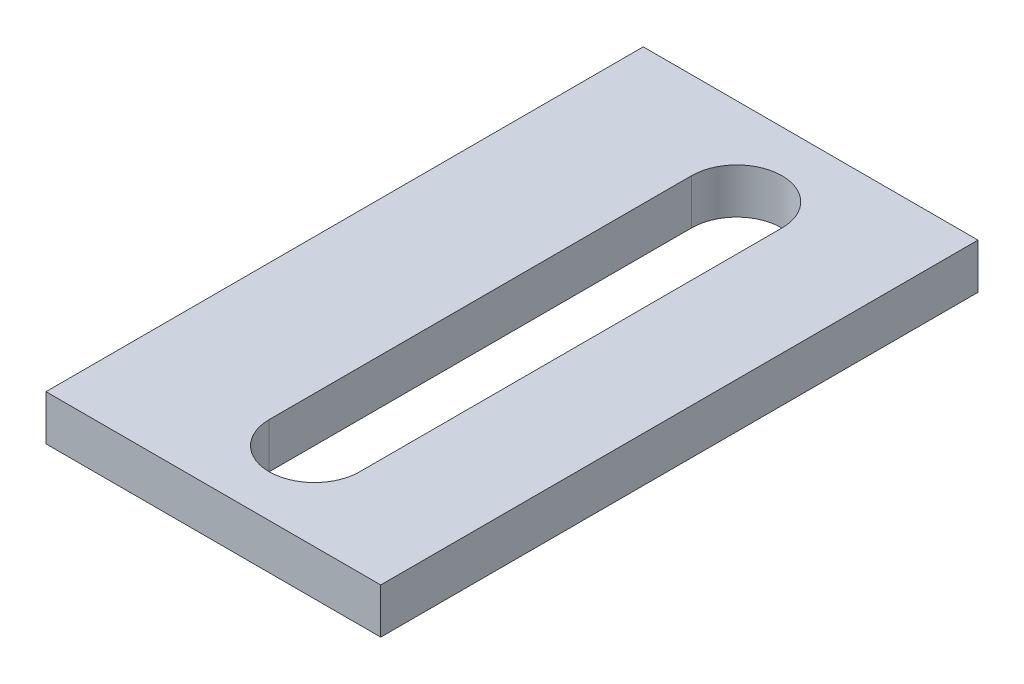
ISO-10303-21;
HEADER;
FILE_DESCRIPTION(('STEP AP214'),'2;1');
FILE_NAME('part.step','',(''),(''),'','','');
FILE_SCHEMA(('AUTOMOTIVE_DESIGN { 1 0 10303 214 1 1 1 1 }'));
ENDSEC;
DATA;
#1=APPLICATION_CONTEXT('core data for automotive mechanical design processes');
#2=APPLICATION_PROTOCOL_DEFINITION('international standard','automotive_design',2000,#1);
#3=PRODUCT_CONTEXT('',#1,'mechanical');
#4=PRODUCT('Part','Part','',(#3));
#5=PRODUCT_RELATED_PRODUCT_CATEGORY('part','',(#4));
#6=PRODUCT_DEFINITION_FORMATION('','',#4);
#7=PRODUCT_DEFINITION_CONTEXT('part definition',#1,'design');
#8=PRODUCT_DEFINITION('design','',#6,#7);
#9=PRODUCT_DEFINITION_SHAPE('','',#8);
#10=(LENGTH_UNIT() NAMED_UNIT(*) SI_UNIT(.MILLI.,.METRE.));
#11=(NAMED_UNIT(*) PLANE_ANGLE_UNIT() SI_UNIT($,.RADIAN.));
#12=(NAMED_UNIT(*) SI_UNIT($,.STERADIAN.) SOLID_ANGLE_UNIT());
#13=UNCERTAINTY_MEASURE_WITH_UNIT(LENGTH_MEASURE(1.E-05),#10,'distance_accuracy_value','');
#14=(GEOMETRIC_REPRESENTATION_CONTEXT(3) GLOBAL_UNCERTAINTY_ASSIGNED_CONTEXT((#13)) GLOBAL_UNIT_ASSIGNED_CONTEXT((#10,
#11,#12)) REPRESENTATION_CONTEXT('',''));
#15=CARTESIAN_POINT('',(0.,0.,0.));
#16=DIRECTION('',(0.,0.,1.));
#17=DIRECTION('',(1.,0.,0.));
#18=AXIS2_PLACEMENT_3D('',#15,#16,#17);
#19=CARTESIAN_POINT('',(-12.,8.4,6.9));
#20=DIRECTION('',(1.,0.,0.));
#21=DIRECTION('',(0.,0.,-1.));
#22=AXIS2_PLACEMENT_3D('',#19,#20,#21);
#23=PLANE('',#22);
#24=DIRECTION('',(0.,1.,0.));
#25=VECTOR('',#24,1.);
#26=CARTESIAN_POINT('',(-12.,8.4,-9.9));
#27=LINE('',#26,#25);
#28=CARTESIAN_POINT('',(-12.,6.9,-9.9));
#29=VERTEX_POINT('',#28);
#30=CARTESIAN_POINT('',(-12.,8.4,-9.9));
#31=VERTEX_POINT('',#30);
#32=EDGE_CURVE('E121',#29,#31,#27,.T.);
#33=ORIENTED_EDGE('',*,*,#32,.F.);
#34=DIRECTION('',(0.,0.,-1.));
#35=VECTOR('',#34,1.);
#36=CARTESIAN_POINT('',(-12.,6.9,-9.9));
#37=LINE('',#36,#35);
#38=CARTESIAN_POINT('',(-12.,6.9,9.9));
#39=VERTEX_POINT('',#38);
#40=EDGE_CURVE('E107',#39,#29,#37,.T.);
#41=ORIENTED_EDGE('',*,*,#40,.F.);
#42=DIRECTION('',(0.,-1.,0.));
#43=VECTOR('',#42,1.);
#44=CARTESIAN_POINT('',(-12.,8.4,9.9));
#45=LINE('',#44,#43);
#46=CARTESIAN_POINT('',(-12.,8.4,9.9));
#47=VERTEX_POINT('',#46);
#48=EDGE_CURVE('E137',#47,#39,#45,.T.);
#49=ORIENTED_EDGE('',*,*,#48,.F.);
#50=DIRECTION('',(0.,0.,1.));
#51=VECTOR('',#50,1.);
#52=CARTESIAN_POINT('',(-12.,8.4,6.9));
#53=LINE('',#52,#51);
#54=EDGE_CURVE('E128',#31,#47,#53,.T.);
#55=ORIENTED_EDGE('',*,*,#54,.F.);
#56=EDGE_LOOP('',(#33,#41,#49,#55));
#57=FACE_BOUND('',#56,.T.);
#58=ADVANCED_FACE('F44',(#57),#23,.F.);
#59=CARTESIAN_POINT('',(0.,8.4,0.));
#60=DIRECTION('',(0.,1.,0.));
#61=DIRECTION('',(0.,0.,1.));
#62=AXIS2_PLACEMENT_3D('',#59,#60,#61);
#63=PLANE('',#62);
#64=DIRECTION('',(0.,0.,1.));
#65=VECTOR('',#64,1.);
#66=CARTESIAN_POINT('',(-0.902865486843041,8.4,-26.1));
#67=LINE('',#66,#65);
#68=CARTESIAN_POINT('',(-0.902865486843041,8.4,-9.9));
#69=VERTEX_POINT('',#68);
#70=CARTESIAN_POINT('',(-0.902865486843041,8.4,9.9));
#71=VERTEX_POINT('',#70);
#72=EDGE_CURVE('E181',#69,#71,#67,.T.);
#73=ORIENTED_EDGE('',*,*,#72,.F.);
#74=DIRECTION('',(1.,0.,0.));
#75=VECTOR('',#74,1.);
#76=CARTESIAN_POINT('',(-12.,8.4,-9.9));
#77=LINE('',#76,#75);
#78=EDGE_CURVE('E131',#31,#69,#77,.T.);
#79=ORIENTED_EDGE('',*,*,#78,.F.);
#80=ORIENTED_EDGE('',*,*,#54,.T.);
#81=DIRECTION('',(-1.,0.,0.));
#82=VECTOR('',#81,1.);
#83=CARTESIAN_POINT('',(-12.,8.4,9.9));
#84=LINE('',#83,#82);
#85=EDGE_CURVE('E132',#71,#47,#84,.T.);
#86=ORIENTED_EDGE('',*,*,#85,.F.);
#87=EDGE_LOOP('',(#73,#79,#80,#86));
#88=FACE_BOUND('',#87,.T.);
#89=CARTESIAN_POINT('',(-6.,8.4,-7.));
#90=DIRECTION('',(0.,1.,0.));
#91=DIRECTION('',(0.,0.,1.));
#92=AXIS2_PLACEMENT_3D('',#89,#90,#91);
#93=CIRCLE('',#92,1.5);
#94=CARTESIAN_POINT('',(-4.5,8.4,-7.));
#95=VERTEX_POINT('',#94);
#96=CARTESIAN_POINT('',(-7.5,8.4,-7.));
#97=VERTEX_POINT('',#96);
#98=EDGE_CURVE('E11',#95,#97,#93,.T.);
#99=ORIENTED_EDGE('',*,*,#98,.F.);
#100=DIRECTION('',(0.,0.,-1.));
#101=VECTOR('',#100,1.);
#102=CARTESIAN_POINT('',(-4.5,8.4,0.));
#103=LINE('',#102,#101);
#104=CARTESIAN_POINT('',(-4.5,8.4,7.));
#105=VERTEX_POINT('',#104);
#106=EDGE_CURVE('E146',#105,#95,#103,.T.);
#107=ORIENTED_EDGE('',*,*,#106,.F.);
#108=CARTESIAN_POINT('',(-6.,8.4,7.));
#109=DIRECTION('',(0.,1.,0.));
#110=DIRECTION('',(0.,0.,1.));
#111=AXIS2_PLACEMENT_3D('',#108,#109,#110);
#112=CIRCLE('',#111,1.5);
#113=CARTESIAN_POINT('',(-7.5,8.4,7.));
#114=VERTEX_POINT('',#113);
#115=EDGE_CURVE('E52',#114,#105,#112,.T.);
#116=ORIENTED_EDGE('',*,*,#115,.F.);
#117=DIRECTION('',(0.,0.,1.));
#118=VECTOR('',#117,1.);
#119=CARTESIAN_POINT('',(-7.5,8.4,0.));
#120=LINE('',#119,#118);
#121=EDGE_CURVE('E143',#97,#114,#120,.T.);
#122=ORIENTED_EDGE('',*,*,#121,.F.);
#123=EDGE_LOOP('',(#99,#107,#116,#122));
#124=FACE_BOUND('',#123,.T.);
#125=ADVANCED_FACE('F163',(#88,#124),#63,.T.);
#126=CARTESIAN_POINT('',(0.,0.,-9.9));
#127=DIRECTION('',(0.,0.,1.));
#128=DIRECTION('',(1.,0.,0.));
#129=AXIS2_PLACEMENT_3D('',#126,#127,#128);
#130=PLANE('',#129);
#131=DIRECTION('',(0.,-1.,0.));
#132=VECTOR('',#131,1.);
#133=CARTESIAN_POINT('',(-0.902865486843041,0.,-9.9));
#134=LINE('',#133,#132);
#135=CARTESIAN_POINT('',(-0.902865486843041,6.9,-9.9));
#136=VERTEX_POINT('',#135);
#137=EDGE_CURVE('E123',#69,#136,#134,.T.);
#138=ORIENTED_EDGE('',*,*,#137,.T.);
#139=DIRECTION('',(1.,0.,0.));
#140=VECTOR('',#139,1.);
#141=CARTESIAN_POINT('',(-12.,6.9,-9.9));
#142=LINE('',#141,#140);
#143=EDGE_CURVE('E67',#29,#136,#142,.T.);
#144=ORIENTED_EDGE('',*,*,#143,.F.);
#145=ORIENTED_EDGE('',*,*,#32,.T.);
#146=ORIENTED_EDGE('',*,*,#78,.T.);
#147=EDGE_LOOP('',(#138,#144,#145,#146));
#148=FACE_BOUND('',#147,.T.);
#149=ADVANCED_FACE('F119',(#148),#130,.F.);
#150=CARTESIAN_POINT('',(0.,0.,9.9));
#151=DIRECTION('',(0.,0.,1.));
#152=DIRECTION('',(1.,0.,0.));
#153=AXIS2_PLACEMENT_3D('',#150,#151,#152);
#154=PLANE('',#153);
#155=DIRECTION('',(-1.,0.,0.));
#156=VECTOR('',#155,1.);
#157=CARTESIAN_POINT('',(0.,6.9,9.9));
#158=LINE('',#157,#156);
#159=CARTESIAN_POINT('',(-0.902865486843041,6.9,9.9));
#160=VERTEX_POINT('',#159);
#161=EDGE_CURVE('E110',#160,#39,#158,.T.);
#162=ORIENTED_EDGE('',*,*,#161,.F.);
#163=DIRECTION('',(0.,-1.,0.));
#164=VECTOR('',#163,1.);
#165=CARTESIAN_POINT('',(-0.902865486843041,8.4,9.9));
#166=LINE('',#165,#164);
#167=EDGE_CURVE('E184',#71,#160,#166,.T.);
#168=ORIENTED_EDGE('',*,*,#167,.F.);
#169=ORIENTED_EDGE('',*,*,#85,.T.);
#170=ORIENTED_EDGE('',*,*,#48,.T.);
#171=EDGE_LOOP('',(#162,#168,#169,#170));
#172=FACE_BOUND('',#171,.T.);
#173=ADVANCED_FACE('F206',(#172),#154,.T.);
#174=CARTESIAN_POINT('',(-6.,-30.6,-7.));
#175=DIRECTION('',(0.,1.,0.));
#176=DIRECTION('',(0.,0.,1.));
#177=AXIS2_PLACEMENT_3D('',#174,#175,#176);
#178=CYLINDRICAL_SURFACE('',#177,1.5);
#179=DIRECTION('',(0.,1.,0.));
#180=VECTOR('',#179,1.);
#181=CARTESIAN_POINT('',(-7.5,-30.6,-7.));
#182=LINE('',#181,#180);
#183=CARTESIAN_POINT('',(-7.5,6.9,-7.));
#184=VERTEX_POINT('',#183);
#185=EDGE_CURVE('E172',#184,#97,#182,.T.);
#186=ORIENTED_EDGE('',*,*,#185,.F.);
#187=CARTESIAN_POINT('',(-6.,6.9,-7.));
#188=DIRECTION('',(0.,1.,0.));
#189=DIRECTION('',(0.,0.,1.));
#190=AXIS2_PLACEMENT_3D('',#187,#188,#189);
#191=CIRCLE('',#190,1.5);
#192=CARTESIAN_POINT('',(-4.5,6.9,-7.));
#193=VERTEX_POINT('',#192);
#194=EDGE_CURVE('E59',#184,#193,#191,.F.);
#195=ORIENTED_EDGE('',*,*,#194,.T.);
#196=DIRECTION('',(0.,1.,0.));
#197=VECTOR('',#196,1.);
#198=CARTESIAN_POINT('',(-4.5,-30.6,-7.));
#199=LINE('',#198,#197);
#200=EDGE_CURVE('E147',#193,#95,#199,.T.);
#201=ORIENTED_EDGE('',*,*,#200,.T.);
#202=ORIENTED_EDGE('',*,*,#98,.T.);
#203=EDGE_LOOP('',(#186,#195,#201,#202));
#204=FACE_BOUND('',#203,.T.);
#205=ADVANCED_FACE('F220',(#204),#178,.F.);
#206=CARTESIAN_POINT('',(-6.,-30.6,7.));
#207=DIRECTION('',(0.,1.,0.));
#208=DIRECTION('',(0.,0.,1.));
#209=AXIS2_PLACEMENT_3D('',#206,#207,#208);
#210=CYLINDRICAL_SURFACE('',#209,1.5);
#211=DIRECTION('',(0.,1.,0.));
#212=VECTOR('',#211,1.);
#213=CARTESIAN_POINT('',(-4.5,-30.6,7.));
#214=LINE('',#213,#212);
#215=CARTESIAN_POINT('',(-4.5,6.9,7.));
#216=VERTEX_POINT('',#215);
#217=EDGE_CURVE('E156',#216,#105,#214,.T.);
#218=ORIENTED_EDGE('',*,*,#217,.F.);
#219=CARTESIAN_POINT('',(-6.,6.9,7.));
#220=DIRECTION('',(0.,1.,0.));
#221=DIRECTION('',(0.,0.,1.));
#222=AXIS2_PLACEMENT_3D('',#219,#220,#221);
#223=CIRCLE('',#222,1.5);
#224=CARTESIAN_POINT('',(-7.5,6.9,7.));
#225=VERTEX_POINT('',#224);
#226=EDGE_CURVE('E196',#216,#225,#223,.F.);
#227=ORIENTED_EDGE('',*,*,#226,.T.);
#228=DIRECTION('',(0.,1.,0.));
#229=VECTOR('',#228,1.);
#230=CARTESIAN_POINT('',(-7.5,-30.6,7.));
#231=LINE('',#230,#229);
#232=EDGE_CURVE('E158',#225,#114,#231,.T.);
#233=ORIENTED_EDGE('',*,*,#232,.T.);
#234=ORIENTED_EDGE('',*,*,#115,.T.);
#235=EDGE_LOOP('',(#218,#227,#233,#234));
#236=FACE_BOUND('',#235,.T.);
#237=ADVANCED_FACE('F154',(#236),#210,.F.);
#238=CARTESIAN_POINT('',(-4.5,-30.6,-7.));
#239=DIRECTION('',(1.,0.,0.));
#240=DIRECTION('',(0.,0.,-1.));
#241=AXIS2_PLACEMENT_3D('',#238,#239,#240);
#242=PLANE('',#241);
#243=ORIENTED_EDGE('',*,*,#200,.F.);
#244=DIRECTION('',(0.,0.,1.));
#245=VECTOR('',#244,1.);
#246=CARTESIAN_POINT('',(-4.5,6.9,-7.));
#247=LINE('',#246,#245);
#248=EDGE_CURVE('E190',#193,#216,#247,.T.);
#249=ORIENTED_EDGE('',*,*,#248,.T.);
#250=ORIENTED_EDGE('',*,*,#217,.T.);
#251=ORIENTED_EDGE('',*,*,#106,.T.);
#252=EDGE_LOOP('',(#243,#249,#250,#251));
#253=FACE_BOUND('',#252,.T.);
#254=ADVANCED_FACE('F227',(#253),#242,.F.);
#255=CARTESIAN_POINT('',(-7.5,-30.6,-7.));
#256=DIRECTION('',(-1.,0.,0.));
#257=DIRECTION('',(0.,0.,1.));
#258=AXIS2_PLACEMENT_3D('',#255,#256,#257);
#259=PLANE('',#258);
#260=ORIENTED_EDGE('',*,*,#232,.F.);
#261=DIRECTION('',(0.,0.,-1.));
#262=VECTOR('',#261,1.);
#263=CARTESIAN_POINT('',(-7.5,6.9,-7.));
#264=LINE('',#263,#262);
#265=EDGE_CURVE('E199',#225,#184,#264,.T.);
#266=ORIENTED_EDGE('',*,*,#265,.T.);
#267=ORIENTED_EDGE('',*,*,#185,.T.);
#268=ORIENTED_EDGE('',*,*,#121,.T.);
#269=EDGE_LOOP('',(#260,#266,#267,#268));
#270=FACE_BOUND('',#269,.T.);
#271=ADVANCED_FACE('F224',(#270),#259,.F.);
#272=CARTESIAN_POINT('',(-0.902865486843041,8.4,-26.1));
#273=DIRECTION('',(-1.,0.,0.));
#274=DIRECTION('',(0.,0.,1.));
#275=AXIS2_PLACEMENT_3D('',#272,#273,#274);
#276=PLANE('',#275);
#277=ORIENTED_EDGE('',*,*,#167,.T.);
#278=DIRECTION('',(0.,0.,1.));
#279=VECTOR('',#278,1.);
#280=CARTESIAN_POINT('',(-0.902865486843041,6.9,-9.9));
#281=LINE('',#280,#279);
#282=EDGE_CURVE('E125',#136,#160,#281,.T.);
#283=ORIENTED_EDGE('',*,*,#282,.F.);
#284=ORIENTED_EDGE('',*,*,#137,.F.);
#285=ORIENTED_EDGE('',*,*,#72,.T.);
#286=EDGE_LOOP('',(#277,#283,#284,#285));
#287=FACE_BOUND('',#286,.T.);
#288=ADVANCED_FACE('F208',(#287),#276,.F.);
#289=CARTESIAN_POINT('',(0.,6.9,0.));
#290=DIRECTION('',(0.,1.,0.));
#291=DIRECTION('',(0.,0.,1.));
#292=AXIS2_PLACEMENT_3D('',#289,#290,#291);
#293=PLANE('',#292);
#294=ORIENTED_EDGE('',*,*,#161,.T.);
#295=ORIENTED_EDGE('',*,*,#40,.T.);
#296=ORIENTED_EDGE('',*,*,#143,.T.);
#297=ORIENTED_EDGE('',*,*,#282,.T.);
#298=EDGE_LOOP('',(#294,#295,#296,#297));
#299=FACE_BOUND('',#298,.T.);
#300=ORIENTED_EDGE('',*,*,#194,.F.);
#301=ORIENTED_EDGE('',*,*,#265,.F.);
#302=ORIENTED_EDGE('',*,*,#226,.F.);
#303=ORIENTED_EDGE('',*,*,#248,.F.);
#304=EDGE_LOOP('',(#300,#301,#302,#303));
#305=FACE_BOUND('',#304,.T.);
#306=ADVANCED_FACE('F108',(#299,#305),#293,.F.);
#307=CLOSED_SHELL('',(#58,#125,#149,#173,#205,#237,#254,#271,#288,#306));
#308=MANIFOLD_SOLID_BREP('B2',#307);
#309=ADVANCED_BREP_SHAPE_REPRESENTATION('',(#18,#308),#14);
#310=SHAPE_DEFINITION_REPRESENTATION(#9,#309);
ENDSEC;
END-ISO-10303-21;
